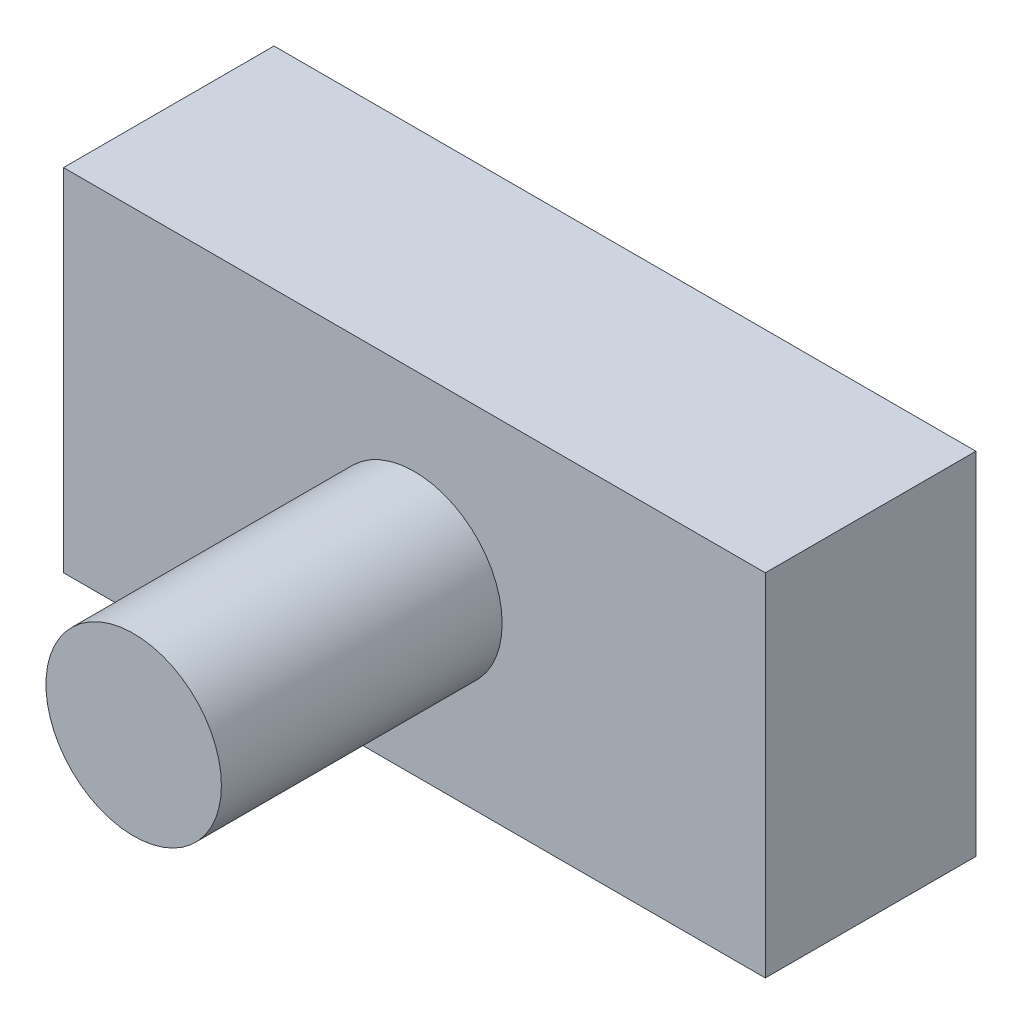
ISO-10303-21;
HEADER;
FILE_DESCRIPTION(('STEP AP214'),'2;1');
FILE_NAME('part.step','',(''),(''),'','','');
FILE_SCHEMA(('AUTOMOTIVE_DESIGN { 1 0 10303 214 1 1 1 1 }'));
ENDSEC;
DATA;
#1=APPLICATION_CONTEXT('core data for automotive mechanical design processes');
#2=APPLICATION_PROTOCOL_DEFINITION('international standard','automotive_design',2000,#1);
#3=PRODUCT_CONTEXT('',#1,'mechanical');
#4=PRODUCT('Part','Part','',(#3));
#5=PRODUCT_RELATED_PRODUCT_CATEGORY('part','',(#4));
#6=PRODUCT_DEFINITION_FORMATION('','',#4);
#7=PRODUCT_DEFINITION_CONTEXT('part definition',#1,'design');
#8=PRODUCT_DEFINITION('design','',#6,#7);
#9=PRODUCT_DEFINITION_SHAPE('','',#8);
#10=(LENGTH_UNIT() NAMED_UNIT(*) SI_UNIT(.MILLI.,.METRE.));
#11=(NAMED_UNIT(*) PLANE_ANGLE_UNIT() SI_UNIT($,.RADIAN.));
#12=(NAMED_UNIT(*) SI_UNIT($,.STERADIAN.) SOLID_ANGLE_UNIT());
#13=UNCERTAINTY_MEASURE_WITH_UNIT(LENGTH_MEASURE(1.E-05),#10,'distance_accuracy_value','');
#14=(GEOMETRIC_REPRESENTATION_CONTEXT(3) GLOBAL_UNCERTAINTY_ASSIGNED_CONTEXT((#13)) GLOBAL_UNIT_ASSIGNED_CONTEXT((#10,
#11,#12)) REPRESENTATION_CONTEXT('',''));
#15=CARTESIAN_POINT('',(0.,0.,0.));
#16=DIRECTION('',(0.,0.,1.));
#17=DIRECTION('',(1.,0.,0.));
#18=AXIS2_PLACEMENT_3D('',#15,#16,#17);
#19=CARTESIAN_POINT('',(0.,0.,60.));
#20=DIRECTION('',(1.,0.,0.));
#21=DIRECTION('',(0.,0.,-1.));
#22=AXIS2_PLACEMENT_3D('',#19,#20,#21);
#23=PLANE('',#22);
#24=DIRECTION('',(0.,-1.,0.));
#25=VECTOR('',#24,1.);
#26=CARTESIAN_POINT('',(0.,0.,0.));
#27=LINE('',#26,#25);
#28=CARTESIAN_POINT('',(0.,100.,0.));
#29=VERTEX_POINT('',#28);
#30=CARTESIAN_POINT('',(0.,0.,0.));
#31=VERTEX_POINT('',#30);
#32=EDGE_CURVE('E110',#29,#31,#27,.T.);
#33=ORIENTED_EDGE('',*,*,#32,.T.);
#34=DIRECTION('',(0.,0.,-1.));
#35=VECTOR('',#34,1.);
#36=CARTESIAN_POINT('',(0.,0.,60.));
#37=LINE('',#36,#35);
#38=CARTESIAN_POINT('',(0.,0.,60.));
#39=VERTEX_POINT('',#38);
#40=EDGE_CURVE('E42',#39,#31,#37,.T.);
#41=ORIENTED_EDGE('',*,*,#40,.F.);
#42=DIRECTION('',(0.,-1.,0.));
#43=VECTOR('',#42,1.);
#44=CARTESIAN_POINT('',(0.,0.,60.));
#45=LINE('',#44,#43);
#46=CARTESIAN_POINT('',(0.,100.,60.));
#47=VERTEX_POINT('',#46);
#48=EDGE_CURVE('E93',#47,#39,#45,.T.);
#49=ORIENTED_EDGE('',*,*,#48,.F.);
#50=DIRECTION('',(0.,0.,-1.));
#51=VECTOR('',#50,1.);
#52=CARTESIAN_POINT('',(0.,100.,60.));
#53=LINE('',#52,#51);
#54=EDGE_CURVE('E106',#47,#29,#53,.T.);
#55=ORIENTED_EDGE('',*,*,#54,.T.);
#56=EDGE_LOOP('',(#33,#41,#49,#55));
#57=FACE_BOUND('',#56,.T.);
#58=ADVANCED_FACE('F39',(#57),#23,.F.);
#59=CARTESIAN_POINT('',(0.,0.,60.));
#60=DIRECTION('',(0.,1.,0.));
#61=DIRECTION('',(0.,0.,1.));
#62=AXIS2_PLACEMENT_3D('',#59,#60,#61);
#63=PLANE('',#62);
#64=DIRECTION('',(1.,0.,0.));
#65=VECTOR('',#64,1.);
#66=CARTESIAN_POINT('',(0.,0.,0.));
#67=LINE('',#66,#65);
#68=CARTESIAN_POINT('',(200.,0.,0.));
#69=VERTEX_POINT('',#68);
#70=EDGE_CURVE('E99',#31,#69,#67,.T.);
#71=ORIENTED_EDGE('',*,*,#70,.T.);
#72=DIRECTION('',(0.,0.,-1.));
#73=VECTOR('',#72,1.);
#74=CARTESIAN_POINT('',(200.,0.,60.));
#75=LINE('',#74,#73);
#76=CARTESIAN_POINT('',(200.,0.,60.));
#77=VERTEX_POINT('',#76);
#78=EDGE_CURVE('E97',#77,#69,#75,.T.);
#79=ORIENTED_EDGE('',*,*,#78,.F.);
#80=DIRECTION('',(1.,0.,0.));
#81=VECTOR('',#80,1.);
#82=CARTESIAN_POINT('',(0.,0.,60.));
#83=LINE('',#82,#81);
#84=EDGE_CURVE('E88',#39,#77,#83,.T.);
#85=ORIENTED_EDGE('',*,*,#84,.F.);
#86=ORIENTED_EDGE('',*,*,#40,.T.);
#87=EDGE_LOOP('',(#71,#79,#85,#86));
#88=FACE_BOUND('',#87,.T.);
#89=ADVANCED_FACE('F98',(#88),#63,.F.);
#90=CARTESIAN_POINT('',(200.,0.,60.));
#91=DIRECTION('',(-1.,0.,0.));
#92=DIRECTION('',(0.,0.,1.));
#93=AXIS2_PLACEMENT_3D('',#90,#91,#92);
#94=PLANE('',#93);
#95=DIRECTION('',(0.,1.,0.));
#96=VECTOR('',#95,1.);
#97=CARTESIAN_POINT('',(200.,0.,0.));
#98=LINE('',#97,#96);
#99=CARTESIAN_POINT('',(200.,100.,0.));
#100=VERTEX_POINT('',#99);
#101=EDGE_CURVE('E74',#69,#100,#98,.T.);
#102=ORIENTED_EDGE('',*,*,#101,.T.);
#103=DIRECTION('',(0.,0.,-1.));
#104=VECTOR('',#103,1.);
#105=CARTESIAN_POINT('',(200.,100.,60.));
#106=LINE('',#105,#104);
#107=CARTESIAN_POINT('',(200.,100.,60.));
#108=VERTEX_POINT('',#107);
#109=EDGE_CURVE('E101',#108,#100,#106,.T.);
#110=ORIENTED_EDGE('',*,*,#109,.F.);
#111=DIRECTION('',(0.,1.,0.));
#112=VECTOR('',#111,1.);
#113=CARTESIAN_POINT('',(200.,0.,60.));
#114=LINE('',#113,#112);
#115=EDGE_CURVE('E91',#77,#108,#114,.T.);
#116=ORIENTED_EDGE('',*,*,#115,.F.);
#117=ORIENTED_EDGE('',*,*,#78,.T.);
#118=EDGE_LOOP('',(#102,#110,#116,#117));
#119=FACE_BOUND('',#118,.T.);
#120=ADVANCED_FACE('F102',(#119),#94,.F.);
#121=CARTESIAN_POINT('',(0.,100.,60.));
#122=DIRECTION('',(0.,-1.,0.));
#123=DIRECTION('',(0.,0.,-1.));
#124=AXIS2_PLACEMENT_3D('',#121,#122,#123);
#125=PLANE('',#124);
#126=DIRECTION('',(-1.,0.,0.));
#127=VECTOR('',#126,1.);
#128=CARTESIAN_POINT('',(0.,100.,0.));
#129=LINE('',#128,#127);
#130=EDGE_CURVE('E80',#100,#29,#129,.T.);
#131=ORIENTED_EDGE('',*,*,#130,.T.);
#132=ORIENTED_EDGE('',*,*,#54,.F.);
#133=DIRECTION('',(-1.,0.,0.));
#134=VECTOR('',#133,1.);
#135=CARTESIAN_POINT('',(0.,100.,60.));
#136=LINE('',#135,#134);
#137=EDGE_CURVE('E57',#108,#47,#136,.T.);
#138=ORIENTED_EDGE('',*,*,#137,.F.);
#139=ORIENTED_EDGE('',*,*,#109,.T.);
#140=EDGE_LOOP('',(#131,#132,#138,#139));
#141=FACE_BOUND('',#140,.T.);
#142=ADVANCED_FACE('F124',(#141),#125,.F.);
#143=CARTESIAN_POINT('',(0.,0.,60.));
#144=DIRECTION('',(0.,0.,-1.));
#145=DIRECTION('',(-1.,0.,0.));
#146=AXIS2_PLACEMENT_3D('',#143,#144,#145);
#147=PLANE('',#146);
#148=CARTESIAN_POINT('',(100.,50.,60.));
#149=DIRECTION('',(0.,0.,1.));
#150=DIRECTION('',(1.,0.,0.));
#151=AXIS2_PLACEMENT_3D('',#148,#149,#150);
#152=CIRCLE('',#151,25.);
#153=CARTESIAN_POINT('',(125.,50.,60.));
#154=VERTEX_POINT('',#153);
#155=EDGE_CURVE('E11',#154,#154,#152,.T.);
#156=ORIENTED_EDGE('',*,*,#155,.F.);
#157=EDGE_LOOP('',(#156));
#158=FACE_BOUND('',#157,.T.);
#159=ORIENTED_EDGE('',*,*,#48,.T.);
#160=ORIENTED_EDGE('',*,*,#84,.T.);
#161=ORIENTED_EDGE('',*,*,#115,.T.);
#162=ORIENTED_EDGE('',*,*,#137,.T.);
#163=EDGE_LOOP('',(#159,#160,#161,#162));
#164=FACE_BOUND('',#163,.T.);
#165=ADVANCED_FACE('F89',(#158,#164),#147,.F.);
#166=CARTESIAN_POINT('',(0.,0.,0.));
#167=DIRECTION('',(0.,0.,-1.));
#168=DIRECTION('',(-1.,0.,0.));
#169=AXIS2_PLACEMENT_3D('',#166,#167,#168);
#170=PLANE('',#169);
#171=ORIENTED_EDGE('',*,*,#32,.F.);
#172=ORIENTED_EDGE('',*,*,#130,.F.);
#173=ORIENTED_EDGE('',*,*,#101,.F.);
#174=ORIENTED_EDGE('',*,*,#70,.F.);
#175=EDGE_LOOP('',(#171,#172,#173,#174));
#176=FACE_BOUND('',#175,.T.);
#177=ADVANCED_FACE('F127',(#176),#170,.T.);
#178=CARTESIAN_POINT('',(100.,50.,140.));
#179=DIRECTION('',(0.,0.,-1.));
#180=DIRECTION('',(-1.,0.,0.));
#181=AXIS2_PLACEMENT_3D('',#178,#179,#180);
#182=CYLINDRICAL_SURFACE('',#181,25.);
#183=CARTESIAN_POINT('',(100.,50.,140.));
#184=DIRECTION('',(0.,0.,1.));
#185=DIRECTION('',(1.,0.,0.));
#186=AXIS2_PLACEMENT_3D('',#183,#184,#185);
#187=CIRCLE('',#186,25.);
#188=CARTESIAN_POINT('',(125.,50.,140.));
#189=VERTEX_POINT('',#188);
#190=EDGE_CURVE('E114',#189,#189,#187,.T.);
#191=ORIENTED_EDGE('',*,*,#190,.F.);
#192=EDGE_LOOP('',(#191));
#193=FACE_BOUND('',#192,.T.);
#194=ORIENTED_EDGE('',*,*,#155,.T.);
#195=EDGE_LOOP('',(#194));
#196=FACE_BOUND('',#195,.T.);
#197=ADVANCED_FACE('F137',(#193,#196),#182,.T.);
#198=CARTESIAN_POINT('',(100.,50.,140.));
#199=DIRECTION('',(0.,0.,1.));
#200=DIRECTION('',(1.,0.,0.));
#201=AXIS2_PLACEMENT_3D('',#198,#199,#200);
#202=PLANE('',#201);
#203=ORIENTED_EDGE('',*,*,#190,.T.);
#204=EDGE_LOOP('',(#203));
#205=FACE_BOUND('',#204,.T.);
#206=ADVANCED_FACE('F135',(#205),#202,.T.);
#207=CLOSED_SHELL('',(#58,#89,#120,#142,#165,#177,#197,#206));
#208=MANIFOLD_SOLID_BREP('B2',#207);
#209=ADVANCED_BREP_SHAPE_REPRESENTATION('',(#18,#208),#14);
#210=SHAPE_DEFINITION_REPRESENTATION(#9,#209);
ENDSEC;
END-ISO-10303-21;
